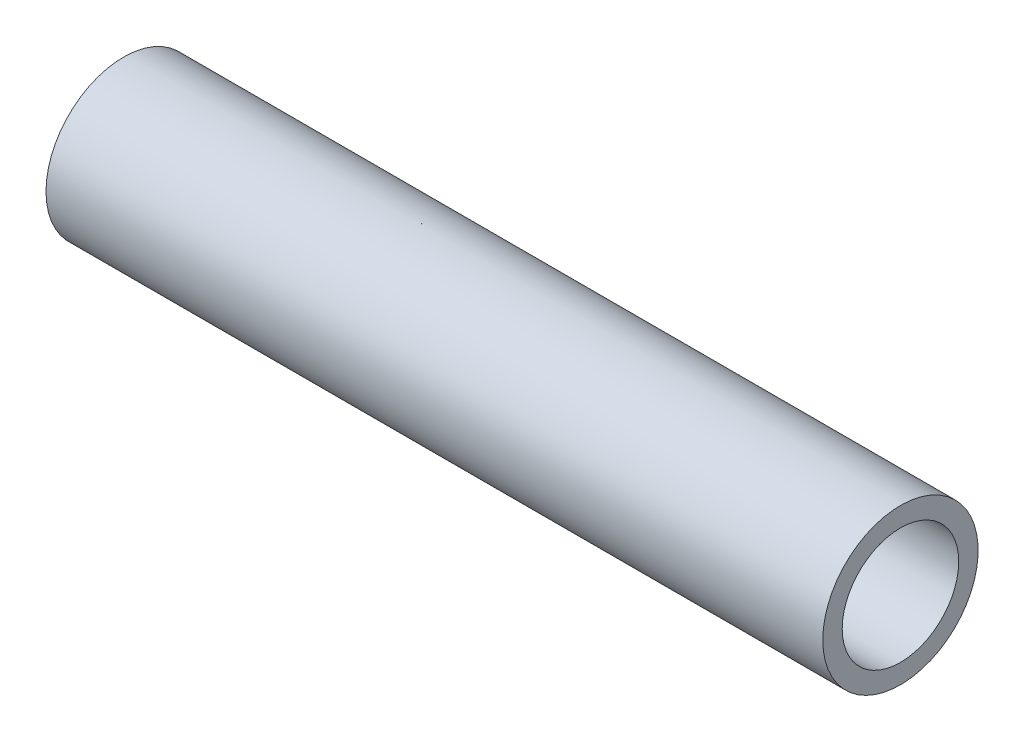
ISO-10303-21;
HEADER;
FILE_DESCRIPTION(('STEP AP214'),'2;1');
FILE_NAME('part.step','',(''),(''),'','','');
FILE_SCHEMA(('AUTOMOTIVE_DESIGN { 1 0 10303 214 1 1 1 1 }'));
ENDSEC;
DATA;
#1=APPLICATION_CONTEXT('core data for automotive mechanical design processes');
#2=APPLICATION_PROTOCOL_DEFINITION('international standard','automotive_design',2000,#1);
#3=PRODUCT_CONTEXT('',#1,'mechanical');
#4=PRODUCT('Part','Part','',(#3));
#5=PRODUCT_RELATED_PRODUCT_CATEGORY('part','',(#4));
#6=PRODUCT_DEFINITION_FORMATION('','',#4);
#7=PRODUCT_DEFINITION_CONTEXT('part definition',#1,'design');
#8=PRODUCT_DEFINITION('design','',#6,#7);
#9=PRODUCT_DEFINITION_SHAPE('','',#8);
#10=(LENGTH_UNIT() NAMED_UNIT(*) SI_UNIT(.MILLI.,.METRE.));
#11=(NAMED_UNIT(*) PLANE_ANGLE_UNIT() SI_UNIT($,.RADIAN.));
#12=(NAMED_UNIT(*) SI_UNIT($,.STERADIAN.) SOLID_ANGLE_UNIT());
#13=UNCERTAINTY_MEASURE_WITH_UNIT(LENGTH_MEASURE(1.E-05),#10,'distance_accuracy_value','');
#14=(GEOMETRIC_REPRESENTATION_CONTEXT(3) GLOBAL_UNCERTAINTY_ASSIGNED_CONTEXT((#13)) GLOBAL_UNIT_ASSIGNED_CONTEXT((#10,
#11,#12)) REPRESENTATION_CONTEXT('',''));
#15=CARTESIAN_POINT('',(0.,0.,0.));
#16=DIRECTION('',(0.,0.,1.));
#17=DIRECTION('',(1.,0.,0.));
#18=AXIS2_PLACEMENT_3D('',#15,#16,#17);
#19=CARTESIAN_POINT('',(0.,0.,0.));
#20=DIRECTION('',(1.,0.,0.));
#21=DIRECTION('',(0.,0.,-1.));
#22=AXIS2_PLACEMENT_3D('',#19,#20,#21);
#23=PLANE('',#22);
#24=CARTESIAN_POINT('',(0.,0.,0.));
#25=DIRECTION('',(-1.,0.,0.));
#26=DIRECTION('',(0.,0.,1.));
#27=AXIS2_PLACEMENT_3D('',#24,#25,#26);
#28=CIRCLE('',#27,4.);
#29=CARTESIAN_POINT('',(0.,0.,4.));
#30=VERTEX_POINT('',#29);
#31=EDGE_CURVE('E96',#30,#30,#28,.T.);
#32=ORIENTED_EDGE('',*,*,#31,.T.);
#33=EDGE_LOOP('',(#32));
#34=FACE_BOUND('',#33,.T.);
#35=CARTESIAN_POINT('',(0.,0.,0.));
#36=DIRECTION('',(1.,0.,0.));
#37=DIRECTION('',(0.,0.,-1.));
#38=AXIS2_PLACEMENT_3D('',#35,#36,#37);
#39=CIRCLE('',#38,3.);
#40=CARTESIAN_POINT('',(0.,0.,-3.));
#41=VERTEX_POINT('',#40);
#42=EDGE_CURVE('E51',#41,#41,#39,.F.);
#43=ORIENTED_EDGE('',*,*,#42,.F.);
#44=EDGE_LOOP('',(#43));
#45=FACE_BOUND('',#44,.T.);
#46=ADVANCED_FACE('F82',(#34,#45),#23,.F.);
#47=CARTESIAN_POINT('',(40.,0.,0.));
#48=DIRECTION('',(-1.,0.,0.));
#49=DIRECTION('',(0.,0.,1.));
#50=AXIS2_PLACEMENT_3D('',#47,#48,#49);
#51=PLANE('',#50);
#52=CARTESIAN_POINT('',(40.,0.,0.));
#53=DIRECTION('',(-1.,0.,0.));
#54=DIRECTION('',(0.,0.,1.));
#55=AXIS2_PLACEMENT_3D('',#52,#53,#54);
#56=CIRCLE('',#55,4.);
#57=CARTESIAN_POINT('',(40.,0.,4.));
#58=VERTEX_POINT('',#57);
#59=EDGE_CURVE('E103',#58,#58,#56,.T.);
#60=ORIENTED_EDGE('',*,*,#59,.F.);
#61=EDGE_LOOP('',(#60));
#62=FACE_BOUND('',#61,.T.);
#63=CARTESIAN_POINT('',(40.,0.,0.));
#64=DIRECTION('',(-1.,0.,0.));
#65=DIRECTION('',(0.,0.,1.));
#66=AXIS2_PLACEMENT_3D('',#63,#64,#65);
#67=CIRCLE('',#66,3.);
#68=CARTESIAN_POINT('',(40.,0.,3.));
#69=VERTEX_POINT('',#68);
#70=EDGE_CURVE('E89',#69,#69,#67,.F.);
#71=ORIENTED_EDGE('',*,*,#70,.F.);
#72=EDGE_LOOP('',(#71));
#73=FACE_BOUND('',#72,.T.);
#74=ADVANCED_FACE('F113',(#62,#73),#51,.F.);
#75=CARTESIAN_POINT('',(0.,0.,0.));
#76=DIRECTION('',(-1.,0.,0.));
#77=DIRECTION('',(0.,0.,1.));
#78=AXIS2_PLACEMENT_3D('',#75,#76,#77);
#79=CYLINDRICAL_SURFACE('',#78,4.);
#80=ORIENTED_EDGE('',*,*,#31,.F.);
#81=EDGE_LOOP('',(#80));
#82=FACE_BOUND('',#81,.T.);
#83=ORIENTED_EDGE('',*,*,#59,.T.);
#84=EDGE_LOOP('',(#83));
#85=FACE_BOUND('',#84,.T.);
#86=ADVANCED_FACE('F111',(#82,#85),#79,.T.);
#87=CARTESIAN_POINT('',(0.,0.,0.));
#88=DIRECTION('',(1.,0.,0.));
#89=DIRECTION('',(0.,0.,-1.));
#90=AXIS2_PLACEMENT_3D('',#87,#88,#89);
#91=CYLINDRICAL_SURFACE('',#90,3.);
#92=ORIENTED_EDGE('',*,*,#70,.T.);
#93=EDGE_LOOP('',(#92));
#94=FACE_BOUND('',#93,.T.);
#95=ORIENTED_EDGE('',*,*,#42,.T.);
#96=EDGE_LOOP('',(#95));
#97=FACE_BOUND('',#96,.T.);
#98=ADVANCED_FACE('F121',(#94,#97),#91,.F.);
#99=CLOSED_SHELL('',(#46,#74,#86,#98));
#100=MANIFOLD_SOLID_BREP('B6',#99);
#101=ADVANCED_BREP_SHAPE_REPRESENTATION('',(#18,#100),#14);
#102=SHAPE_DEFINITION_REPRESENTATION(#9,#101);
ENDSEC;
END-ISO-10303-21;
